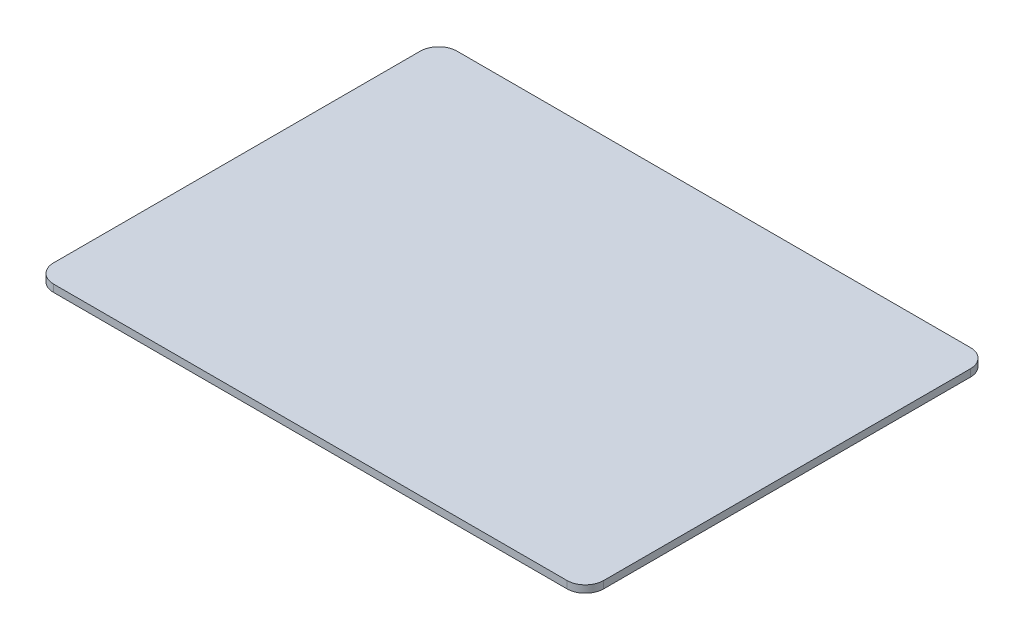
ISO-10303-21;
HEADER;
FILE_DESCRIPTION(('STEP AP214'),'2;1');
FILE_NAME('part.step','',(''),(''),'','','');
FILE_SCHEMA(('AUTOMOTIVE_DESIGN { 1 0 10303 214 1 1 1 1 }'));
ENDSEC;
DATA;
#1=APPLICATION_CONTEXT('core data for automotive mechanical design processes');
#2=APPLICATION_PROTOCOL_DEFINITION('international standard','automotive_design',2000,#1);
#3=PRODUCT_CONTEXT('',#1,'mechanical');
#4=PRODUCT('Part','Part','',(#3));
#5=PRODUCT_RELATED_PRODUCT_CATEGORY('part','',(#4));
#6=PRODUCT_DEFINITION_FORMATION('','',#4);
#7=PRODUCT_DEFINITION_CONTEXT('part definition',#1,'design');
#8=PRODUCT_DEFINITION('design','',#6,#7);
#9=PRODUCT_DEFINITION_SHAPE('','',#8);
#10=(LENGTH_UNIT() NAMED_UNIT(*) SI_UNIT(.MILLI.,.METRE.));
#11=(NAMED_UNIT(*) PLANE_ANGLE_UNIT() SI_UNIT($,.RADIAN.));
#12=(NAMED_UNIT(*) SI_UNIT($,.STERADIAN.) SOLID_ANGLE_UNIT());
#13=UNCERTAINTY_MEASURE_WITH_UNIT(LENGTH_MEASURE(1.E-05),#10,'distance_accuracy_value','');
#14=(GEOMETRIC_REPRESENTATION_CONTEXT(3) GLOBAL_UNCERTAINTY_ASSIGNED_CONTEXT((#13)) GLOBAL_UNIT_ASSIGNED_CONTEXT((#10,
#11,#12)) REPRESENTATION_CONTEXT('',''));
#15=CARTESIAN_POINT('',(0.,0.,0.));
#16=DIRECTION('',(0.,0.,1.));
#17=DIRECTION('',(1.,0.,0.));
#18=AXIS2_PLACEMENT_3D('',#15,#16,#17);
#19=CARTESIAN_POINT('',(28.,0.79375,-20.));
#20=DIRECTION('',(0.,-1.,0.));
#21=DIRECTION('',(0.,0.,-1.));
#22=AXIS2_PLACEMENT_3D('',#19,#20,#21);
#23=CYLINDRICAL_SURFACE('',#22,2.);
#24=CARTESIAN_POINT('',(28.,0.,-20.));
#25=DIRECTION('',(0.,1.,0.));
#26=DIRECTION('',(0.,0.,1.));
#27=AXIS2_PLACEMENT_3D('',#24,#25,#26);
#28=CIRCLE('',#27,2.);
#29=CARTESIAN_POINT('',(30.,0.,-20.));
#30=VERTEX_POINT('',#29);
#31=CARTESIAN_POINT('',(28.,0.,-22.));
#32=VERTEX_POINT('',#31);
#33=EDGE_CURVE('E131',#30,#32,#28,.T.);
#34=ORIENTED_EDGE('',*,*,#33,.T.);
#35=DIRECTION('',(0.,-1.,0.));
#36=VECTOR('',#35,1.);
#37=CARTESIAN_POINT('',(28.,0.79375,-22.));
#38=LINE('',#37,#36);
#39=CARTESIAN_POINT('',(28.,0.79375,-22.));
#40=VERTEX_POINT('',#39);
#41=EDGE_CURVE('E11',#40,#32,#38,.T.);
#42=ORIENTED_EDGE('',*,*,#41,.F.);
#43=CARTESIAN_POINT('',(28.,0.79375,-20.));
#44=DIRECTION('',(0.,1.,0.));
#45=DIRECTION('',(0.,0.,1.));
#46=AXIS2_PLACEMENT_3D('',#43,#44,#45);
#47=CIRCLE('',#46,2.);
#48=CARTESIAN_POINT('',(30.,0.79375,-20.));
#49=VERTEX_POINT('',#48);
#50=EDGE_CURVE('E145',#49,#40,#47,.T.);
#51=ORIENTED_EDGE('',*,*,#50,.F.);
#52=DIRECTION('',(0.,-1.,0.));
#53=VECTOR('',#52,1.);
#54=CARTESIAN_POINT('',(30.,0.79375,-20.));
#55=LINE('',#54,#53);
#56=EDGE_CURVE('E127',#49,#30,#55,.T.);
#57=ORIENTED_EDGE('',*,*,#56,.T.);
#58=EDGE_LOOP('',(#34,#42,#51,#57));
#59=FACE_BOUND('',#58,.T.);
#60=ADVANCED_FACE('F35',(#59),#23,.T.);
#61=CARTESIAN_POINT('',(28.,0.79375,-22.));
#62=DIRECTION('',(0.,0.,1.));
#63=DIRECTION('',(1.,0.,0.));
#64=AXIS2_PLACEMENT_3D('',#61,#62,#63);
#65=PLANE('',#64);
#66=DIRECTION('',(-1.,0.,0.));
#67=VECTOR('',#66,1.);
#68=CARTESIAN_POINT('',(28.,0.,-22.));
#69=LINE('',#68,#67);
#70=CARTESIAN_POINT('',(-28.,0.,-22.));
#71=VERTEX_POINT('',#70);
#72=EDGE_CURVE('E134',#32,#71,#69,.T.);
#73=ORIENTED_EDGE('',*,*,#72,.T.);
#74=DIRECTION('',(0.,-1.,0.));
#75=VECTOR('',#74,1.);
#76=CARTESIAN_POINT('',(-28.,0.79375,-22.));
#77=LINE('',#76,#75);
#78=CARTESIAN_POINT('',(-28.,0.79375,-22.));
#79=VERTEX_POINT('',#78);
#80=EDGE_CURVE('E43',#79,#71,#77,.T.);
#81=ORIENTED_EDGE('',*,*,#80,.F.);
#82=DIRECTION('',(-1.,0.,0.));
#83=VECTOR('',#82,1.);
#84=CARTESIAN_POINT('',(28.,0.79375,-22.));
#85=LINE('',#84,#83);
#86=EDGE_CURVE('E94',#40,#79,#85,.T.);
#87=ORIENTED_EDGE('',*,*,#86,.F.);
#88=ORIENTED_EDGE('',*,*,#41,.T.);
#89=EDGE_LOOP('',(#73,#81,#87,#88));
#90=FACE_BOUND('',#89,.T.);
#91=ADVANCED_FACE('F180',(#90),#65,.F.);
#92=CARTESIAN_POINT('',(-28.,0.79375,-20.));
#93=DIRECTION('',(0.,-1.,0.));
#94=DIRECTION('',(0.,0.,-1.));
#95=AXIS2_PLACEMENT_3D('',#92,#93,#94);
#96=CYLINDRICAL_SURFACE('',#95,2.);
#97=CARTESIAN_POINT('',(-28.,0.,-20.));
#98=DIRECTION('',(0.,1.,0.));
#99=DIRECTION('',(0.,0.,1.));
#100=AXIS2_PLACEMENT_3D('',#97,#98,#99);
#101=CIRCLE('',#100,2.);
#102=CARTESIAN_POINT('',(-30.,0.,-20.));
#103=VERTEX_POINT('',#102);
#104=EDGE_CURVE('E136',#71,#103,#101,.T.);
#105=ORIENTED_EDGE('',*,*,#104,.T.);
#106=DIRECTION('',(0.,-1.,0.));
#107=VECTOR('',#106,1.);
#108=CARTESIAN_POINT('',(-30.,0.79375,-20.));
#109=LINE('',#108,#107);
#110=CARTESIAN_POINT('',(-30.,0.79375,-20.));
#111=VERTEX_POINT('',#110);
#112=EDGE_CURVE('E152',#111,#103,#109,.T.);
#113=ORIENTED_EDGE('',*,*,#112,.F.);
#114=CARTESIAN_POINT('',(-28.,0.79375,-20.));
#115=DIRECTION('',(0.,1.,0.));
#116=DIRECTION('',(0.,0.,1.));
#117=AXIS2_PLACEMENT_3D('',#114,#115,#116);
#118=CIRCLE('',#117,2.);
#119=EDGE_CURVE('E160',#79,#111,#118,.T.);
#120=ORIENTED_EDGE('',*,*,#119,.F.);
#121=ORIENTED_EDGE('',*,*,#80,.T.);
#122=EDGE_LOOP('',(#105,#113,#120,#121));
#123=FACE_BOUND('',#122,.T.);
#124=ADVANCED_FACE('F158',(#123),#96,.T.);
#125=CARTESIAN_POINT('',(-30.,0.79375,20.));
#126=DIRECTION('',(1.,0.,0.));
#127=DIRECTION('',(0.,0.,-1.));
#128=AXIS2_PLACEMENT_3D('',#125,#126,#127);
#129=PLANE('',#128);
#130=DIRECTION('',(0.,0.,1.));
#131=VECTOR('',#130,1.);
#132=CARTESIAN_POINT('',(-30.,0.,20.));
#133=LINE('',#132,#131);
#134=CARTESIAN_POINT('',(-30.,0.,20.));
#135=VERTEX_POINT('',#134);
#136=EDGE_CURVE('E138',#103,#135,#133,.T.);
#137=ORIENTED_EDGE('',*,*,#136,.T.);
#138=DIRECTION('',(0.,-1.,0.));
#139=VECTOR('',#138,1.);
#140=CARTESIAN_POINT('',(-30.,0.79375,20.));
#141=LINE('',#140,#139);
#142=CARTESIAN_POINT('',(-30.,0.79375,20.));
#143=VERTEX_POINT('',#142);
#144=EDGE_CURVE('E149',#143,#135,#141,.T.);
#145=ORIENTED_EDGE('',*,*,#144,.F.);
#146=DIRECTION('',(0.,0.,1.));
#147=VECTOR('',#146,1.);
#148=CARTESIAN_POINT('',(-30.,0.79375,20.));
#149=LINE('',#148,#147);
#150=EDGE_CURVE('E172',#111,#143,#149,.T.);
#151=ORIENTED_EDGE('',*,*,#150,.F.);
#152=ORIENTED_EDGE('',*,*,#112,.T.);
#153=EDGE_LOOP('',(#137,#145,#151,#152));
#154=FACE_BOUND('',#153,.T.);
#155=ADVANCED_FACE('F168',(#154),#129,.F.);
#156=CARTESIAN_POINT('',(-28.,0.79375,20.));
#157=DIRECTION('',(0.,-1.,0.));
#158=DIRECTION('',(0.,0.,-1.));
#159=AXIS2_PLACEMENT_3D('',#156,#157,#158);
#160=CYLINDRICAL_SURFACE('',#159,2.);
#161=CARTESIAN_POINT('',(-28.,0.,20.));
#162=DIRECTION('',(0.,1.,0.));
#163=DIRECTION('',(0.,0.,-1.));
#164=AXIS2_PLACEMENT_3D('',#161,#162,#163);
#165=CIRCLE('',#164,2.);
#166=CARTESIAN_POINT('',(-28.,0.,22.));
#167=VERTEX_POINT('',#166);
#168=EDGE_CURVE('E140',#135,#167,#165,.T.);
#169=ORIENTED_EDGE('',*,*,#168,.T.);
#170=DIRECTION('',(0.,-1.,0.));
#171=VECTOR('',#170,1.);
#172=CARTESIAN_POINT('',(-28.,0.79375,22.));
#173=LINE('',#172,#171);
#174=CARTESIAN_POINT('',(-28.,0.79375,22.));
#175=VERTEX_POINT('',#174);
#176=EDGE_CURVE('E122',#175,#167,#173,.T.);
#177=ORIENTED_EDGE('',*,*,#176,.F.);
#178=CARTESIAN_POINT('',(-28.,0.79375,20.));
#179=DIRECTION('',(0.,1.,0.));
#180=DIRECTION('',(0.,0.,-1.));
#181=AXIS2_PLACEMENT_3D('',#178,#179,#180);
#182=CIRCLE('',#181,2.);
#183=EDGE_CURVE('E113',#143,#175,#182,.T.);
#184=ORIENTED_EDGE('',*,*,#183,.F.);
#185=ORIENTED_EDGE('',*,*,#144,.T.);
#186=EDGE_LOOP('',(#169,#177,#184,#185));
#187=FACE_BOUND('',#186,.T.);
#188=ADVANCED_FACE('F171',(#187),#160,.T.);
#189=CARTESIAN_POINT('',(28.,0.79375,22.));
#190=DIRECTION('',(0.,0.,-1.));
#191=DIRECTION('',(-1.,0.,0.));
#192=AXIS2_PLACEMENT_3D('',#189,#190,#191);
#193=PLANE('',#192);
#194=DIRECTION('',(1.,0.,0.));
#195=VECTOR('',#194,1.);
#196=CARTESIAN_POINT('',(28.,0.,22.));
#197=LINE('',#196,#195);
#198=CARTESIAN_POINT('',(28.,0.,22.));
#199=VERTEX_POINT('',#198);
#200=EDGE_CURVE('E121',#167,#199,#197,.T.);
#201=ORIENTED_EDGE('',*,*,#200,.T.);
#202=DIRECTION('',(0.,-1.,0.));
#203=VECTOR('',#202,1.);
#204=CARTESIAN_POINT('',(28.,0.79375,22.));
#205=LINE('',#204,#203);
#206=CARTESIAN_POINT('',(28.,0.79375,22.));
#207=VERTEX_POINT('',#206);
#208=EDGE_CURVE('E118',#207,#199,#205,.T.);
#209=ORIENTED_EDGE('',*,*,#208,.F.);
#210=DIRECTION('',(1.,0.,0.));
#211=VECTOR('',#210,1.);
#212=CARTESIAN_POINT('',(28.,0.79375,22.));
#213=LINE('',#212,#211);
#214=EDGE_CURVE('E107',#175,#207,#213,.T.);
#215=ORIENTED_EDGE('',*,*,#214,.F.);
#216=ORIENTED_EDGE('',*,*,#176,.T.);
#217=EDGE_LOOP('',(#201,#209,#215,#216));
#218=FACE_BOUND('',#217,.T.);
#219=ADVANCED_FACE('F119',(#218),#193,.F.);
#220=CARTESIAN_POINT('',(28.,0.79375,20.));
#221=DIRECTION('',(0.,-1.,0.));
#222=DIRECTION('',(0.,0.,-1.));
#223=AXIS2_PLACEMENT_3D('',#220,#221,#222);
#224=CYLINDRICAL_SURFACE('',#223,2.);
#225=CARTESIAN_POINT('',(28.,0.,20.));
#226=DIRECTION('',(0.,1.,0.));
#227=DIRECTION('',(0.,0.,1.));
#228=AXIS2_PLACEMENT_3D('',#225,#226,#227);
#229=CIRCLE('',#228,2.);
#230=CARTESIAN_POINT('',(30.,0.,20.));
#231=VERTEX_POINT('',#230);
#232=EDGE_CURVE('E80',#199,#231,#229,.T.);
#233=ORIENTED_EDGE('',*,*,#232,.T.);
#234=DIRECTION('',(0.,-1.,0.));
#235=VECTOR('',#234,1.);
#236=CARTESIAN_POINT('',(30.,0.79375,20.));
#237=LINE('',#236,#235);
#238=CARTESIAN_POINT('',(30.,0.79375,20.));
#239=VERTEX_POINT('',#238);
#240=EDGE_CURVE('E123',#239,#231,#237,.T.);
#241=ORIENTED_EDGE('',*,*,#240,.F.);
#242=CARTESIAN_POINT('',(28.,0.79375,20.));
#243=DIRECTION('',(0.,1.,0.));
#244=DIRECTION('',(0.,0.,1.));
#245=AXIS2_PLACEMENT_3D('',#242,#243,#244);
#246=CIRCLE('',#245,2.);
#247=EDGE_CURVE('E111',#207,#239,#246,.T.);
#248=ORIENTED_EDGE('',*,*,#247,.F.);
#249=ORIENTED_EDGE('',*,*,#208,.T.);
#250=EDGE_LOOP('',(#233,#241,#248,#249));
#251=FACE_BOUND('',#250,.T.);
#252=ADVANCED_FACE('F125',(#251),#224,.T.);
#253=CARTESIAN_POINT('',(30.,0.79375,20.));
#254=DIRECTION('',(-1.,0.,0.));
#255=DIRECTION('',(0.,0.,1.));
#256=AXIS2_PLACEMENT_3D('',#253,#254,#255);
#257=PLANE('',#256);
#258=DIRECTION('',(0.,0.,-1.));
#259=VECTOR('',#258,1.);
#260=CARTESIAN_POINT('',(30.,0.,20.));
#261=LINE('',#260,#259);
#262=EDGE_CURVE('E86',#231,#30,#261,.T.);
#263=ORIENTED_EDGE('',*,*,#262,.T.);
#264=ORIENTED_EDGE('',*,*,#56,.F.);
#265=DIRECTION('',(0.,0.,-1.));
#266=VECTOR('',#265,1.);
#267=CARTESIAN_POINT('',(30.,0.79375,20.));
#268=LINE('',#267,#266);
#269=EDGE_CURVE('E51',#239,#49,#268,.T.);
#270=ORIENTED_EDGE('',*,*,#269,.F.);
#271=ORIENTED_EDGE('',*,*,#240,.T.);
#272=EDGE_LOOP('',(#263,#264,#270,#271));
#273=FACE_BOUND('',#272,.T.);
#274=ADVANCED_FACE('F196',(#273),#257,.F.);
#275=CARTESIAN_POINT('',(28.,0.79375,-20.));
#276=DIRECTION('',(0.,1.,0.));
#277=DIRECTION('',(0.,0.,1.));
#278=AXIS2_PLACEMENT_3D('',#275,#276,#277);
#279=PLANE('',#278);
#280=ORIENTED_EDGE('',*,*,#50,.T.);
#281=ORIENTED_EDGE('',*,*,#86,.T.);
#282=ORIENTED_EDGE('',*,*,#119,.T.);
#283=ORIENTED_EDGE('',*,*,#150,.T.);
#284=ORIENTED_EDGE('',*,*,#183,.T.);
#285=ORIENTED_EDGE('',*,*,#214,.T.);
#286=ORIENTED_EDGE('',*,*,#247,.T.);
#287=ORIENTED_EDGE('',*,*,#269,.T.);
#288=EDGE_LOOP('',(#280,#281,#282,#283,#284,#285,#286,#287));
#289=FACE_BOUND('',#288,.T.);
#290=ADVANCED_FACE('F109',(#289),#279,.T.);
#291=CARTESIAN_POINT('',(28.,0.,-20.));
#292=DIRECTION('',(0.,1.,0.));
#293=DIRECTION('',(0.,0.,1.));
#294=AXIS2_PLACEMENT_3D('',#291,#292,#293);
#295=PLANE('',#294);
#296=ORIENTED_EDGE('',*,*,#33,.F.);
#297=ORIENTED_EDGE('',*,*,#262,.F.);
#298=ORIENTED_EDGE('',*,*,#232,.F.);
#299=ORIENTED_EDGE('',*,*,#200,.F.);
#300=ORIENTED_EDGE('',*,*,#168,.F.);
#301=ORIENTED_EDGE('',*,*,#136,.F.);
#302=ORIENTED_EDGE('',*,*,#104,.F.);
#303=ORIENTED_EDGE('',*,*,#72,.F.);
#304=EDGE_LOOP('',(#296,#297,#298,#299,#300,#301,#302,#303));
#305=FACE_BOUND('',#304,.T.);
#306=ADVANCED_FACE('F164',(#305),#295,.F.);
#307=CLOSED_SHELL('',(#60,#91,#124,#155,#188,#219,#252,#274,#290,#306));
#308=MANIFOLD_SOLID_BREP('B2',#307);
#309=ADVANCED_BREP_SHAPE_REPRESENTATION('',(#18,#308),#14);
#310=SHAPE_DEFINITION_REPRESENTATION(#9,#309);
ENDSEC;
END-ISO-10303-21;
